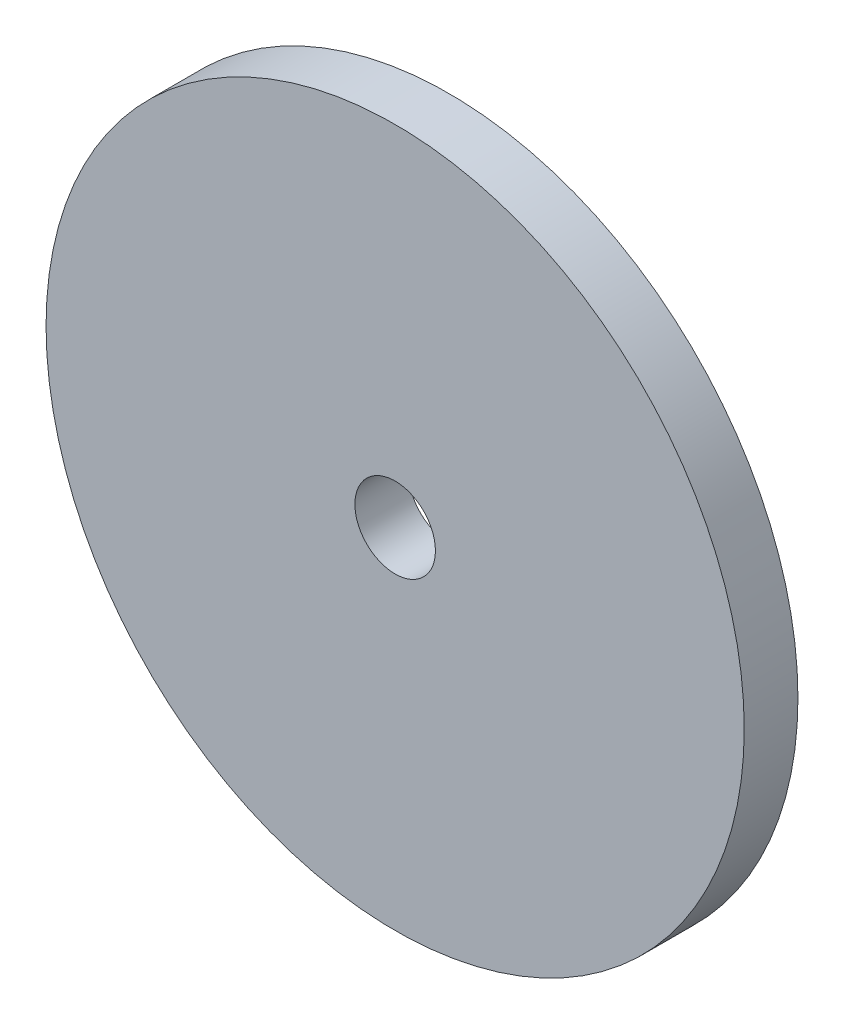
ISO-10303-21;
HEADER;
FILE_DESCRIPTION(('STEP AP214'),'2;1');
FILE_NAME('part.step','',(''),(''),'','','');
FILE_SCHEMA(('AUTOMOTIVE_DESIGN { 1 0 10303 214 1 1 1 1 }'));
ENDSEC;
DATA;
#1=APPLICATION_CONTEXT('core data for automotive mechanical design processes');
#2=APPLICATION_PROTOCOL_DEFINITION('international standard','automotive_design',2000,#1);
#3=PRODUCT_CONTEXT('',#1,'mechanical');
#4=PRODUCT('Part','Part','',(#3));
#5=PRODUCT_RELATED_PRODUCT_CATEGORY('part','',(#4));
#6=PRODUCT_DEFINITION_FORMATION('','',#4);
#7=PRODUCT_DEFINITION_CONTEXT('part definition',#1,'design');
#8=PRODUCT_DEFINITION('design','',#6,#7);
#9=PRODUCT_DEFINITION_SHAPE('','',#8);
#10=(LENGTH_UNIT() NAMED_UNIT(*) SI_UNIT(.MILLI.,.METRE.));
#11=(NAMED_UNIT(*) PLANE_ANGLE_UNIT() SI_UNIT($,.RADIAN.));
#12=(NAMED_UNIT(*) SI_UNIT($,.STERADIAN.) SOLID_ANGLE_UNIT());
#13=UNCERTAINTY_MEASURE_WITH_UNIT(LENGTH_MEASURE(1.E-05),#10,'distance_accuracy_value','');
#14=(GEOMETRIC_REPRESENTATION_CONTEXT(3) GLOBAL_UNCERTAINTY_ASSIGNED_CONTEXT((#13)) GLOBAL_UNIT_ASSIGNED_CONTEXT((#10,
#11,#12)) REPRESENTATION_CONTEXT('',''));
#15=CARTESIAN_POINT('',(0.,0.,0.));
#16=DIRECTION('',(0.,0.,1.));
#17=DIRECTION('',(1.,0.,0.));
#18=AXIS2_PLACEMENT_3D('',#15,#16,#17);
#19=CARTESIAN_POINT('',(0.,0.,2.));
#20=DIRECTION('',(0.,0.,-1.));
#21=DIRECTION('',(-1.,0.,0.));
#22=AXIS2_PLACEMENT_3D('',#19,#20,#21);
#23=CYLINDRICAL_SURFACE('',#22,13.);
#24=CARTESIAN_POINT('',(0.,0.,2.));
#25=DIRECTION('',(0.,0.,1.));
#26=DIRECTION('',(1.,0.,0.));
#27=AXIS2_PLACEMENT_3D('',#24,#25,#26);
#28=CIRCLE('',#27,13.);
#29=CARTESIAN_POINT('',(13.,0.,2.));
#30=VERTEX_POINT('',#29);
#31=EDGE_CURVE('E10',#30,#30,#28,.T.);
#32=ORIENTED_EDGE('',*,*,#31,.F.);
#33=EDGE_LOOP('',(#32));
#34=FACE_BOUND('',#33,.T.);
#35=CARTESIAN_POINT('',(0.,0.,0.));
#36=DIRECTION('',(0.,0.,1.));
#37=DIRECTION('',(1.,0.,0.));
#38=AXIS2_PLACEMENT_3D('',#35,#36,#37);
#39=CIRCLE('',#38,13.);
#40=CARTESIAN_POINT('',(13.,0.,0.));
#41=VERTEX_POINT('',#40);
#42=EDGE_CURVE('E49',#41,#41,#39,.T.);
#43=ORIENTED_EDGE('',*,*,#42,.T.);
#44=EDGE_LOOP('',(#43));
#45=FACE_BOUND('',#44,.T.);
#46=ADVANCED_FACE('F41',(#34,#45),#23,.T.);
#47=CARTESIAN_POINT('',(0.,0.,2.));
#48=DIRECTION('',(0.,0.,1.));
#49=DIRECTION('',(1.,0.,0.));
#50=AXIS2_PLACEMENT_3D('',#47,#48,#49);
#51=PLANE('',#50);
#52=CARTESIAN_POINT('',(0.,0.,2.));
#53=DIRECTION('',(0.,0.,1.));
#54=DIRECTION('',(1.,0.,0.));
#55=AXIS2_PLACEMENT_3D('',#52,#53,#54);
#56=CIRCLE('',#55,1.5);
#57=CARTESIAN_POINT('',(1.5,0.,2.));
#58=VERTEX_POINT('',#57);
#59=EDGE_CURVE('E56',#58,#58,#56,.T.);
#60=ORIENTED_EDGE('',*,*,#59,.F.);
#61=EDGE_LOOP('',(#60));
#62=FACE_BOUND('',#61,.T.);
#63=ORIENTED_EDGE('',*,*,#31,.T.);
#64=EDGE_LOOP('',(#63));
#65=FACE_BOUND('',#64,.T.);
#66=ADVANCED_FACE('F74',(#62,#65),#51,.T.);
#67=CARTESIAN_POINT('',(0.,0.,0.));
#68=DIRECTION('',(0.,0.,1.));
#69=DIRECTION('',(1.,0.,0.));
#70=AXIS2_PLACEMENT_3D('',#67,#68,#69);
#71=PLANE('',#70);
#72=CARTESIAN_POINT('',(0.,0.,0.));
#73=DIRECTION('',(0.,0.,1.));
#74=DIRECTION('',(1.,0.,0.));
#75=AXIS2_PLACEMENT_3D('',#72,#73,#74);
#76=CIRCLE('',#75,1.5);
#77=CARTESIAN_POINT('',(1.5,0.,0.));
#78=VERTEX_POINT('',#77);
#79=EDGE_CURVE('E44',#78,#78,#76,.T.);
#80=ORIENTED_EDGE('',*,*,#79,.T.);
#81=EDGE_LOOP('',(#80));
#82=FACE_BOUND('',#81,.T.);
#83=ORIENTED_EDGE('',*,*,#42,.F.);
#84=EDGE_LOOP('',(#83));
#85=FACE_BOUND('',#84,.T.);
#86=ADVANCED_FACE('F65',(#82,#85),#71,.F.);
#87=CARTESIAN_POINT('',(0.,0.,-8.));
#88=DIRECTION('',(0.,0.,1.));
#89=DIRECTION('',(1.,0.,0.));
#90=AXIS2_PLACEMENT_3D('',#87,#88,#89);
#91=CYLINDRICAL_SURFACE('',#90,1.5);
#92=ORIENTED_EDGE('',*,*,#59,.T.);
#93=EDGE_LOOP('',(#92));
#94=FACE_BOUND('',#93,.T.);
#95=ORIENTED_EDGE('',*,*,#79,.F.);
#96=EDGE_LOOP('',(#95));
#97=FACE_BOUND('',#96,.T.);
#98=ADVANCED_FACE('F68',(#94,#97),#91,.F.);
#99=CLOSED_SHELL('',(#46,#66,#86,#98));
#100=MANIFOLD_SOLID_BREP('B2',#99);
#101=ADVANCED_BREP_SHAPE_REPRESENTATION('',(#18,#100),#14);
#102=SHAPE_DEFINITION_REPRESENTATION(#9,#101);
ENDSEC;
END-ISO-10303-21;
